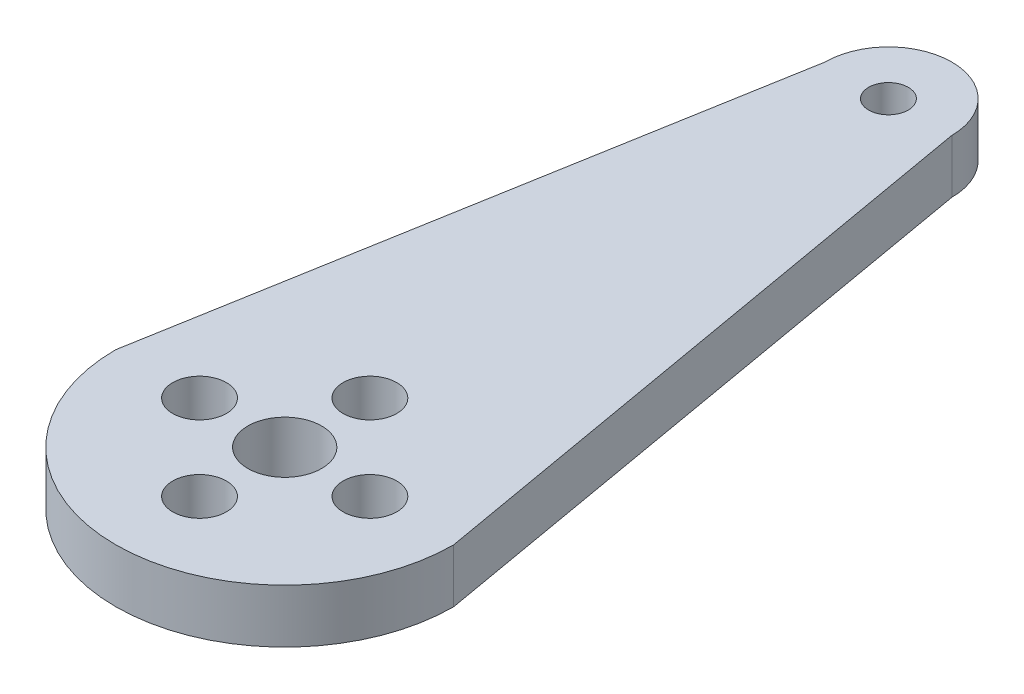
ISO-10303-21;
HEADER;
FILE_DESCRIPTION(('STEP AP214'),'2;1');
FILE_NAME('part.step','',(''),(''),'','','');
FILE_SCHEMA(('AUTOMOTIVE_DESIGN { 1 0 10303 214 1 1 1 1 }'));
ENDSEC;
DATA;
#1=APPLICATION_CONTEXT('core data for automotive mechanical design processes');
#2=APPLICATION_PROTOCOL_DEFINITION('international standard','automotive_design',2000,#1);
#3=PRODUCT_CONTEXT('',#1,'mechanical');
#4=PRODUCT('Part','Part','',(#3));
#5=PRODUCT_RELATED_PRODUCT_CATEGORY('part','',(#4));
#6=PRODUCT_DEFINITION_FORMATION('','',#4);
#7=PRODUCT_DEFINITION_CONTEXT('part definition',#1,'design');
#8=PRODUCT_DEFINITION('design','',#6,#7);
#9=PRODUCT_DEFINITION_SHAPE('','',#8);
#10=(LENGTH_UNIT() NAMED_UNIT(*) SI_UNIT(.MILLI.,.METRE.));
#11=(NAMED_UNIT(*) PLANE_ANGLE_UNIT() SI_UNIT($,.RADIAN.));
#12=(NAMED_UNIT(*) SI_UNIT($,.STERADIAN.) SOLID_ANGLE_UNIT());
#13=UNCERTAINTY_MEASURE_WITH_UNIT(LENGTH_MEASURE(1.E-05),#10,'distance_accuracy_value','');
#14=(GEOMETRIC_REPRESENTATION_CONTEXT(3) GLOBAL_UNCERTAINTY_ASSIGNED_CONTEXT((#13)) GLOBAL_UNIT_ASSIGNED_CONTEXT((#10,
#11,#12)) REPRESENTATION_CONTEXT('',''));
#15=CARTESIAN_POINT('',(0.,0.,0.));
#16=DIRECTION('',(0.,0.,1.));
#17=DIRECTION('',(1.,0.,0.));
#18=AXIS2_PLACEMENT_3D('',#15,#16,#17);
#19=CARTESIAN_POINT('',(12.222628410282,4.,-2.13666942637343));
#20=DIRECTION('',(0.98506179636688,0.,-0.172201211779868));
#21=DIRECTION('',(-0.172201211779868,0.,-0.98506179636688));
#22=AXIS2_PLACEMENT_3D('',#19,#20,#21);
#23=PLANE('',#22);
#24=DIRECTION('',(0.172201211779868,0.,0.98506179636688));
#25=VECTOR('',#24,1.);
#26=CARTESIAN_POINT('',(12.222628410282,0.,-2.13666942637343));
#27=LINE('',#26,#25);
#28=CARTESIAN_POINT('',(4.72957823523438,0.,-45.));
#29=VERTEX_POINT('',#28);
#30=CARTESIAN_POINT('',(12.5961451437007,0.,0.));
#31=VERTEX_POINT('',#30);
#32=EDGE_CURVE('E118',#29,#31,#27,.T.);
#33=ORIENTED_EDGE('',*,*,#32,.F.);
#34=DIRECTION('',(0.,-1.,0.));
#35=VECTOR('',#34,1.);
#36=CARTESIAN_POINT('',(4.72957823523438,4.,-45.));
#37=LINE('',#36,#35);
#38=CARTESIAN_POINT('',(4.72957823523438,4.,-45.));
#39=VERTEX_POINT('',#38);
#40=EDGE_CURVE('E11',#39,#29,#37,.T.);
#41=ORIENTED_EDGE('',*,*,#40,.F.);
#42=DIRECTION('',(0.172201211779868,0.,0.98506179636688));
#43=VECTOR('',#42,1.);
#44=CARTESIAN_POINT('',(12.222628410282,4.,-2.13666942637343));
#45=LINE('',#44,#43);
#46=CARTESIAN_POINT('',(12.5961451437007,4.,0.));
#47=VERTEX_POINT('',#46);
#48=EDGE_CURVE('E88',#39,#47,#45,.T.);
#49=ORIENTED_EDGE('',*,*,#48,.T.);
#50=DIRECTION('',(0.,-1.,0.));
#51=VECTOR('',#50,1.);
#52=CARTESIAN_POINT('',(12.5961451437007,4.,0.));
#53=LINE('',#52,#51);
#54=EDGE_CURVE('E76',#47,#31,#53,.T.);
#55=ORIENTED_EDGE('',*,*,#54,.T.);
#56=EDGE_LOOP('',(#33,#41,#49,#55));
#57=FACE_BOUND('',#56,.T.);
#58=ADVANCED_FACE('F37',(#57),#23,.T.);
#59=CARTESIAN_POINT('',(0.,4.,-45.));
#60=DIRECTION('',(0.,-1.,0.));
#61=DIRECTION('',(0.,0.,-1.));
#62=AXIS2_PLACEMENT_3D('',#59,#60,#61);
#63=CYLINDRICAL_SURFACE('',#62,4.72957823523438);
#64=CARTESIAN_POINT('',(0.,0.,-45.));
#65=DIRECTION('',(0.,1.,0.));
#66=DIRECTION('',(0.,0.,1.));
#67=AXIS2_PLACEMENT_3D('',#64,#65,#66);
#68=CIRCLE('',#67,4.72957823523438);
#69=CARTESIAN_POINT('',(-4.72957823523438,0.,-45.));
#70=VERTEX_POINT('',#69);
#71=EDGE_CURVE('E93',#29,#70,#68,.T.);
#72=ORIENTED_EDGE('',*,*,#71,.T.);
#73=DIRECTION('',(0.,-1.,0.));
#74=VECTOR('',#73,1.);
#75=CARTESIAN_POINT('',(-4.72957823523438,4.,-45.));
#76=LINE('',#75,#74);
#77=CARTESIAN_POINT('',(-4.72957823523438,4.,-45.));
#78=VERTEX_POINT('',#77);
#79=EDGE_CURVE('E45',#78,#70,#76,.T.);
#80=ORIENTED_EDGE('',*,*,#79,.F.);
#81=CARTESIAN_POINT('',(0.,4.,-45.));
#82=DIRECTION('',(0.,1.,0.));
#83=DIRECTION('',(0.,0.,1.));
#84=AXIS2_PLACEMENT_3D('',#81,#82,#83);
#85=CIRCLE('',#84,4.72957823523438);
#86=EDGE_CURVE('E82',#39,#78,#85,.T.);
#87=ORIENTED_EDGE('',*,*,#86,.F.);
#88=ORIENTED_EDGE('',*,*,#40,.T.);
#89=EDGE_LOOP('',(#72,#80,#87,#88));
#90=FACE_BOUND('',#89,.T.);
#91=ADVANCED_FACE('F91',(#90),#63,.T.);
#92=CARTESIAN_POINT('',(-12.222628410282,4.,-2.13666942637343));
#93=DIRECTION('',(0.98506179636688,0.,0.172201211779868));
#94=DIRECTION('',(0.172201211779868,0.,-0.98506179636688));
#95=AXIS2_PLACEMENT_3D('',#92,#93,#94);
#96=PLANE('',#95);
#97=DIRECTION('',(-0.172201211779868,0.,0.98506179636688));
#98=VECTOR('',#97,1.);
#99=CARTESIAN_POINT('',(-12.222628410282,0.,-2.13666942637343));
#100=LINE('',#99,#98);
#101=CARTESIAN_POINT('',(-12.5961451437007,0.,0.));
#102=VERTEX_POINT('',#101);
#103=EDGE_CURVE('E69',#70,#102,#100,.T.);
#104=ORIENTED_EDGE('',*,*,#103,.T.);
#105=DIRECTION('',(0.,-1.,0.));
#106=VECTOR('',#105,1.);
#107=CARTESIAN_POINT('',(-12.5961451437007,4.,0.));
#108=LINE('',#107,#106);
#109=CARTESIAN_POINT('',(-12.5961451437007,4.,0.));
#110=VERTEX_POINT('',#109);
#111=EDGE_CURVE('E94',#110,#102,#108,.T.);
#112=ORIENTED_EDGE('',*,*,#111,.F.);
#113=DIRECTION('',(-0.172201211779868,0.,0.98506179636688));
#114=VECTOR('',#113,1.);
#115=CARTESIAN_POINT('',(-12.222628410282,4.,-2.13666942637343));
#116=LINE('',#115,#114);
#117=EDGE_CURVE('E87',#78,#110,#116,.T.);
#118=ORIENTED_EDGE('',*,*,#117,.F.);
#119=ORIENTED_EDGE('',*,*,#79,.T.);
#120=EDGE_LOOP('',(#104,#112,#118,#119));
#121=FACE_BOUND('',#120,.T.);
#122=ADVANCED_FACE('F95',(#121),#96,.F.);
#123=CARTESIAN_POINT('',(3.59400408331214E-13,4.,6.35));
#124=DIRECTION('',(0.,-1.,0.));
#125=DIRECTION('',(0.,0.,-1.));
#126=AXIS2_PLACEMENT_3D('',#123,#124,#125);
#127=CYLINDRICAL_SURFACE('',#126,2.);
#128=CARTESIAN_POINT('',(3.59400408331214E-13,4.,6.35));
#129=DIRECTION('',(0.,1.,0.));
#130=DIRECTION('',(0.,0.,1.));
#131=AXIS2_PLACEMENT_3D('',#128,#129,#130);
#132=CIRCLE('',#131,2.);
#133=CARTESIAN_POINT('',(3.59400408331214E-13,4.,8.35));
#134=VERTEX_POINT('',#133);
#135=EDGE_CURVE('E112',#134,#134,#132,.T.);
#136=ORIENTED_EDGE('',*,*,#135,.T.);
#137=EDGE_LOOP('',(#136));
#138=FACE_BOUND('',#137,.T.);
#139=CARTESIAN_POINT('',(3.59400408331214E-13,0.,6.35));
#140=DIRECTION('',(0.,1.,0.));
#141=DIRECTION('',(0.,0.,1.));
#142=AXIS2_PLACEMENT_3D('',#139,#140,#141);
#143=CIRCLE('',#142,2.);
#144=CARTESIAN_POINT('',(3.59400408331214E-13,0.,8.35));
#145=VERTEX_POINT('',#144);
#146=EDGE_CURVE('E137',#145,#145,#143,.T.);
#147=ORIENTED_EDGE('',*,*,#146,.F.);
#148=EDGE_LOOP('',(#147));
#149=FACE_BOUND('',#148,.T.);
#150=ADVANCED_FACE('F157',(#138,#149),#127,.F.);
#151=CARTESIAN_POINT('',(6.35000000000018,4.,-1.79700204165607E-13));
#152=DIRECTION('',(0.,-1.,0.));
#153=DIRECTION('',(0.,0.,-1.));
#154=AXIS2_PLACEMENT_3D('',#151,#152,#153);
#155=CYLINDRICAL_SURFACE('',#154,2.);
#156=CARTESIAN_POINT('',(6.35000000000018,4.,-1.79700204165607E-13));
#157=DIRECTION('',(0.,1.,0.));
#158=DIRECTION('',(0.,0.,1.));
#159=AXIS2_PLACEMENT_3D('',#156,#157,#158);
#160=CIRCLE('',#159,2.);
#161=CARTESIAN_POINT('',(6.35000000000018,4.,1.99999999999982));
#162=VERTEX_POINT('',#161);
#163=EDGE_CURVE('E109',#162,#162,#160,.T.);
#164=ORIENTED_EDGE('',*,*,#163,.T.);
#165=EDGE_LOOP('',(#164));
#166=FACE_BOUND('',#165,.T.);
#167=CARTESIAN_POINT('',(6.35000000000018,0.,-1.79700204165607E-13));
#168=DIRECTION('',(0.,1.,0.));
#169=DIRECTION('',(0.,0.,1.));
#170=AXIS2_PLACEMENT_3D('',#167,#168,#169);
#171=CIRCLE('',#170,2.);
#172=CARTESIAN_POINT('',(6.35000000000018,0.,1.99999999999982));
#173=VERTEX_POINT('',#172);
#174=EDGE_CURVE('E134',#173,#173,#171,.T.);
#175=ORIENTED_EDGE('',*,*,#174,.F.);
#176=EDGE_LOOP('',(#175));
#177=FACE_BOUND('',#176,.T.);
#178=ADVANCED_FACE('F174',(#166,#177),#155,.F.);
#179=CARTESIAN_POINT('',(0.,4.,-6.35));
#180=DIRECTION('',(0.,-1.,0.));
#181=DIRECTION('',(0.,0.,-1.));
#182=AXIS2_PLACEMENT_3D('',#179,#180,#181);
#183=CYLINDRICAL_SURFACE('',#182,2.);
#184=CARTESIAN_POINT('',(0.,4.,-6.35));
#185=DIRECTION('',(0.,1.,0.));
#186=DIRECTION('',(0.,0.,1.));
#187=AXIS2_PLACEMENT_3D('',#184,#185,#186);
#188=CIRCLE('',#187,2.);
#189=CARTESIAN_POINT('',(0.,4.,-4.35));
#190=VERTEX_POINT('',#189);
#191=EDGE_CURVE('E106',#190,#190,#188,.T.);
#192=ORIENTED_EDGE('',*,*,#191,.T.);
#193=EDGE_LOOP('',(#192));
#194=FACE_BOUND('',#193,.T.);
#195=CARTESIAN_POINT('',(0.,0.,-6.35));
#196=DIRECTION('',(0.,1.,0.));
#197=DIRECTION('',(0.,0.,1.));
#198=AXIS2_PLACEMENT_3D('',#195,#196,#197);
#199=CIRCLE('',#198,2.);
#200=CARTESIAN_POINT('',(0.,0.,-4.35));
#201=VERTEX_POINT('',#200);
#202=EDGE_CURVE('E131',#201,#201,#199,.T.);
#203=ORIENTED_EDGE('',*,*,#202,.F.);
#204=EDGE_LOOP('',(#203));
#205=FACE_BOUND('',#204,.T.);
#206=ADVANCED_FACE('F170',(#194,#205),#183,.F.);
#207=CARTESIAN_POINT('',(0.,4.,0.));
#208=DIRECTION('',(0.,-1.,0.));
#209=DIRECTION('',(0.,0.,-1.));
#210=AXIS2_PLACEMENT_3D('',#207,#208,#209);
#211=CYLINDRICAL_SURFACE('',#210,2.75);
#212=CARTESIAN_POINT('',(0.,4.,0.));
#213=DIRECTION('',(0.,1.,0.));
#214=DIRECTION('',(0.,0.,1.));
#215=AXIS2_PLACEMENT_3D('',#212,#213,#214);
#216=CIRCLE('',#215,2.75);
#217=CARTESIAN_POINT('',(0.,4.,2.75));
#218=VERTEX_POINT('',#217);
#219=EDGE_CURVE('E103',#218,#218,#216,.T.);
#220=ORIENTED_EDGE('',*,*,#219,.T.);
#221=EDGE_LOOP('',(#220));
#222=FACE_BOUND('',#221,.T.);
#223=CARTESIAN_POINT('',(0.,0.,0.));
#224=DIRECTION('',(0.,1.,0.));
#225=DIRECTION('',(0.,0.,1.));
#226=AXIS2_PLACEMENT_3D('',#223,#224,#225);
#227=CIRCLE('',#226,2.75);
#228=CARTESIAN_POINT('',(0.,0.,2.75));
#229=VERTEX_POINT('',#228);
#230=EDGE_CURVE('E128',#229,#229,#227,.T.);
#231=ORIENTED_EDGE('',*,*,#230,.F.);
#232=EDGE_LOOP('',(#231));
#233=FACE_BOUND('',#232,.T.);
#234=ADVANCED_FACE('F166',(#222,#233),#211,.F.);
#235=CARTESIAN_POINT('',(0.,4.,-45.));
#236=DIRECTION('',(0.,-1.,0.));
#237=DIRECTION('',(0.,0.,-1.));
#238=AXIS2_PLACEMENT_3D('',#235,#236,#237);
#239=CYLINDRICAL_SURFACE('',#238,1.475);
#240=CARTESIAN_POINT('',(0.,4.,-45.));
#241=DIRECTION('',(0.,1.,0.));
#242=DIRECTION('',(0.,0.,1.));
#243=AXIS2_PLACEMENT_3D('',#240,#241,#242);
#244=CIRCLE('',#243,1.475);
#245=CARTESIAN_POINT('',(0.,4.,-43.525));
#246=VERTEX_POINT('',#245);
#247=EDGE_CURVE('E97',#246,#246,#244,.T.);
#248=ORIENTED_EDGE('',*,*,#247,.T.);
#249=EDGE_LOOP('',(#248));
#250=FACE_BOUND('',#249,.T.);
#251=CARTESIAN_POINT('',(0.,0.,-45.));
#252=DIRECTION('',(0.,1.,0.));
#253=DIRECTION('',(0.,0.,1.));
#254=AXIS2_PLACEMENT_3D('',#251,#252,#253);
#255=CIRCLE('',#254,1.475);
#256=CARTESIAN_POINT('',(0.,0.,-43.525));
#257=VERTEX_POINT('',#256);
#258=EDGE_CURVE('E125',#257,#257,#255,.T.);
#259=ORIENTED_EDGE('',*,*,#258,.F.);
#260=EDGE_LOOP('',(#259));
#261=FACE_BOUND('',#260,.T.);
#262=ADVANCED_FACE('F163',(#250,#261),#239,.F.);
#263=CARTESIAN_POINT('',(0.,4.,0.));
#264=DIRECTION('',(0.,-1.,0.));
#265=DIRECTION('',(0.,0.,-1.));
#266=AXIS2_PLACEMENT_3D('',#263,#264,#265);
#267=CYLINDRICAL_SURFACE('',#266,12.5961451437007);
#268=CARTESIAN_POINT('',(0.,0.,0.));
#269=DIRECTION('',(0.,1.,0.));
#270=DIRECTION('',(0.,0.,1.));
#271=AXIS2_PLACEMENT_3D('',#268,#269,#270);
#272=CIRCLE('',#271,12.5961451437007);
#273=EDGE_CURVE('E123',#102,#31,#272,.T.);
#274=ORIENTED_EDGE('',*,*,#273,.T.);
#275=ORIENTED_EDGE('',*,*,#54,.F.);
#276=CARTESIAN_POINT('',(0.,4.,0.));
#277=DIRECTION('',(0.,1.,0.));
#278=DIRECTION('',(0.,0.,1.));
#279=AXIS2_PLACEMENT_3D('',#276,#277,#278);
#280=CIRCLE('',#279,12.5961451437007);
#281=EDGE_CURVE('E53',#110,#47,#280,.T.);
#282=ORIENTED_EDGE('',*,*,#281,.F.);
#283=ORIENTED_EDGE('',*,*,#111,.T.);
#284=EDGE_LOOP('',(#274,#275,#282,#283));
#285=FACE_BOUND('',#284,.T.);
#286=ADVANCED_FACE('F146',(#285),#267,.T.);
#287=CARTESIAN_POINT('',(-6.34999999999982,4.,1.80477854883065E-13));
#288=DIRECTION('',(0.,-1.,0.));
#289=DIRECTION('',(0.,0.,-1.));
#290=AXIS2_PLACEMENT_3D('',#287,#288,#289);
#291=CYLINDRICAL_SURFACE('',#290,2.);
#292=CARTESIAN_POINT('',(-6.34999999999982,4.,1.80477854883065E-13));
#293=DIRECTION('',(0.,1.,0.));
#294=DIRECTION('',(0.,0.,1.));
#295=AXIS2_PLACEMENT_3D('',#292,#293,#294);
#296=CIRCLE('',#295,2.);
#297=CARTESIAN_POINT('',(-6.34999999999982,4.,2.00000000000018));
#298=VERTEX_POINT('',#297);
#299=EDGE_CURVE('E115',#298,#298,#296,.T.);
#300=ORIENTED_EDGE('',*,*,#299,.T.);
#301=EDGE_LOOP('',(#300));
#302=FACE_BOUND('',#301,.T.);
#303=CARTESIAN_POINT('',(-6.34999999999982,0.,1.80477854883065E-13));
#304=DIRECTION('',(0.,1.,0.));
#305=DIRECTION('',(0.,0.,1.));
#306=AXIS2_PLACEMENT_3D('',#303,#304,#305);
#307=CIRCLE('',#306,2.);
#308=CARTESIAN_POINT('',(-6.34999999999982,0.,2.00000000000018));
#309=VERTEX_POINT('',#308);
#310=EDGE_CURVE('E140',#309,#309,#307,.T.);
#311=ORIENTED_EDGE('',*,*,#310,.F.);
#312=EDGE_LOOP('',(#311));
#313=FACE_BOUND('',#312,.T.);
#314=ADVANCED_FACE('F162',(#302,#313),#291,.F.);
#315=CARTESIAN_POINT('',(0.,4.,0.));
#316=DIRECTION('',(0.,1.,0.));
#317=DIRECTION('',(0.,0.,1.));
#318=AXIS2_PLACEMENT_3D('',#315,#316,#317);
#319=PLANE('',#318);
#320=ORIENTED_EDGE('',*,*,#48,.F.);
#321=ORIENTED_EDGE('',*,*,#86,.T.);
#322=ORIENTED_EDGE('',*,*,#117,.T.);
#323=ORIENTED_EDGE('',*,*,#281,.T.);
#324=EDGE_LOOP('',(#320,#321,#322,#323));
#325=FACE_BOUND('',#324,.T.);
#326=ORIENTED_EDGE('',*,*,#247,.F.);
#327=EDGE_LOOP('',(#326));
#328=FACE_BOUND('',#327,.T.);
#329=ORIENTED_EDGE('',*,*,#219,.F.);
#330=EDGE_LOOP('',(#329));
#331=FACE_BOUND('',#330,.T.);
#332=ORIENTED_EDGE('',*,*,#191,.F.);
#333=EDGE_LOOP('',(#332));
#334=FACE_BOUND('',#333,.T.);
#335=ORIENTED_EDGE('',*,*,#163,.F.);
#336=EDGE_LOOP('',(#335));
#337=FACE_BOUND('',#336,.T.);
#338=ORIENTED_EDGE('',*,*,#135,.F.);
#339=EDGE_LOOP('',(#338));
#340=FACE_BOUND('',#339,.T.);
#341=ORIENTED_EDGE('',*,*,#299,.F.);
#342=EDGE_LOOP('',(#341));
#343=FACE_BOUND('',#342,.T.);
#344=ADVANCED_FACE('F84',(#325,#328,#331,#334,#337,#340,#343),#319,.T.);
#345=CARTESIAN_POINT('',(0.,0.,0.));
#346=DIRECTION('',(0.,1.,0.));
#347=DIRECTION('',(0.,0.,1.));
#348=AXIS2_PLACEMENT_3D('',#345,#346,#347);
#349=PLANE('',#348);
#350=ORIENTED_EDGE('',*,*,#32,.T.);
#351=ORIENTED_EDGE('',*,*,#273,.F.);
#352=ORIENTED_EDGE('',*,*,#103,.F.);
#353=ORIENTED_EDGE('',*,*,#71,.F.);
#354=EDGE_LOOP('',(#350,#351,#352,#353));
#355=FACE_BOUND('',#354,.T.);
#356=ORIENTED_EDGE('',*,*,#258,.T.);
#357=EDGE_LOOP('',(#356));
#358=FACE_BOUND('',#357,.T.);
#359=ORIENTED_EDGE('',*,*,#230,.T.);
#360=EDGE_LOOP('',(#359));
#361=FACE_BOUND('',#360,.T.);
#362=ORIENTED_EDGE('',*,*,#202,.T.);
#363=EDGE_LOOP('',(#362));
#364=FACE_BOUND('',#363,.T.);
#365=ORIENTED_EDGE('',*,*,#174,.T.);
#366=EDGE_LOOP('',(#365));
#367=FACE_BOUND('',#366,.T.);
#368=ORIENTED_EDGE('',*,*,#146,.T.);
#369=EDGE_LOOP('',(#368));
#370=FACE_BOUND('',#369,.T.);
#371=ORIENTED_EDGE('',*,*,#310,.T.);
#372=EDGE_LOOP('',(#371));
#373=FACE_BOUND('',#372,.T.);
#374=ADVANCED_FACE('F148',(#355,#358,#361,#364,#367,#370,#373),#349,.F.);
#375=CLOSED_SHELL('',(#58,#91,#122,#150,#178,#206,#234,#262,#286,#314,#344,#374));
#376=MANIFOLD_SOLID_BREP('B2',#375);
#377=ADVANCED_BREP_SHAPE_REPRESENTATION('',(#18,#376),#14);
#378=SHAPE_DEFINITION_REPRESENTATION(#9,#377);
ENDSEC;
END-ISO-10303-21;
